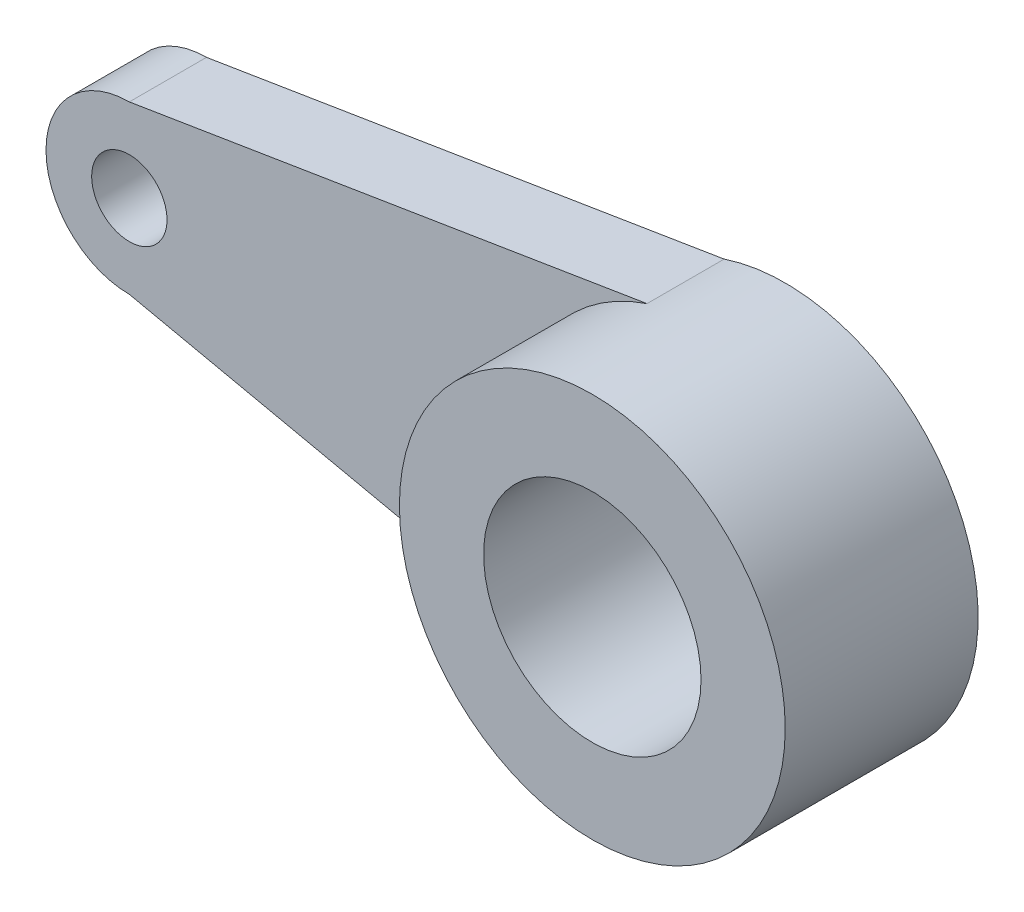
ISO-10303-21;
HEADER;
FILE_DESCRIPTION(('STEP AP214'),'2;1');
FILE_NAME('part.step','',(''),(''),'','','');
FILE_SCHEMA(('AUTOMOTIVE_DESIGN { 1 0 10303 214 1 1 1 1 }'));
ENDSEC;
DATA;
#1=APPLICATION_CONTEXT('core data for automotive mechanical design processes');
#2=APPLICATION_PROTOCOL_DEFINITION('international standard','automotive_design',2000,#1);
#3=PRODUCT_CONTEXT('',#1,'mechanical');
#4=PRODUCT('Part','Part','',(#3));
#5=PRODUCT_RELATED_PRODUCT_CATEGORY('part','',(#4));
#6=PRODUCT_DEFINITION_FORMATION('','',#4);
#7=PRODUCT_DEFINITION_CONTEXT('part definition',#1,'design');
#8=PRODUCT_DEFINITION('design','',#6,#7);
#9=PRODUCT_DEFINITION_SHAPE('','',#8);
#10=(LENGTH_UNIT() NAMED_UNIT(*) SI_UNIT(.MILLI.,.METRE.));
#11=(NAMED_UNIT(*) PLANE_ANGLE_UNIT() SI_UNIT($,.RADIAN.));
#12=(NAMED_UNIT(*) SI_UNIT($,.STERADIAN.) SOLID_ANGLE_UNIT());
#13=UNCERTAINTY_MEASURE_WITH_UNIT(LENGTH_MEASURE(1.E-05),#10,'distance_accuracy_value','');
#14=(GEOMETRIC_REPRESENTATION_CONTEXT(3) GLOBAL_UNCERTAINTY_ASSIGNED_CONTEXT((#13)) GLOBAL_UNIT_ASSIGNED_CONTEXT((#10,
#11,#12)) REPRESENTATION_CONTEXT('',''));
#15=CARTESIAN_POINT('',(0.,0.,0.));
#16=DIRECTION('',(0.,0.,1.));
#17=DIRECTION('',(1.,0.,0.));
#18=AXIS2_PLACEMENT_3D('',#15,#16,#17);
#19=CARTESIAN_POINT('',(20.9795633613523,15.1546389726253,5.));
#20=DIRECTION('',(0.,0.,1.));
#21=DIRECTION('',(1.,0.,0.));
#22=AXIS2_PLACEMENT_3D('',#19,#20,#21);
#23=PLANE('',#22);
#24=CARTESIAN_POINT('',(20.9795633613523,15.1546389726253,5.));
#25=DIRECTION('',(0.,0.,1.));
#26=DIRECTION('',(1.,0.,0.));
#27=AXIS2_PLACEMENT_3D('',#24,#25,#26);
#28=CIRCLE('',#27,5.);
#29=CARTESIAN_POINT('',(25.9795633613523,15.1546389726253,5.));
#30=VERTEX_POINT('',#29);
#31=EDGE_CURVE('E112',#30,#30,#28,.T.);
#32=ORIENTED_EDGE('',*,*,#31,.T.);
#33=EDGE_LOOP('',(#32));
#34=FACE_BOUND('',#33,.T.);
#35=CARTESIAN_POINT('',(20.9795633613523,15.1546389726253,5.));
#36=DIRECTION('',(0.,0.,1.));
#37=DIRECTION('',(1.,0.,0.));
#38=AXIS2_PLACEMENT_3D('',#35,#36,#37);
#39=CIRCLE('',#38,2.8179093361604);
#40=CARTESIAN_POINT('',(23.7974726975127,15.1546389726253,5.));
#41=VERTEX_POINT('',#40);
#42=EDGE_CURVE('E106',#41,#41,#39,.T.);
#43=ORIENTED_EDGE('',*,*,#42,.F.);
#44=EDGE_LOOP('',(#43));
#45=FACE_BOUND('',#44,.T.);
#46=ADVANCED_FACE('F33',(#34,#45),#23,.T.);
#47=CARTESIAN_POINT('',(20.9795633613523,15.1546389726253,0.));
#48=DIRECTION('',(0.,0.,1.));
#49=DIRECTION('',(1.,0.,0.));
#50=AXIS2_PLACEMENT_3D('',#47,#48,#49);
#51=PLANE('',#50);
#52=CARTESIAN_POINT('',(20.9795633613523,15.1546389726253,0.));
#53=DIRECTION('',(0.,0.,1.));
#54=DIRECTION('',(1.,0.,0.));
#55=AXIS2_PLACEMENT_3D('',#52,#53,#54);
#56=CIRCLE('',#55,5.);
#57=CARTESIAN_POINT('',(18.9143539599568,10.6010788128835,0.));
#58=VERTEX_POINT('',#57);
#59=CARTESIAN_POINT('',(19.3963911171883,19.897377173845,0.));
#60=VERTEX_POINT('',#59);
#61=EDGE_CURVE('E109',#58,#60,#56,.T.);
#62=ORIENTED_EDGE('',*,*,#61,.F.);
#63=DIRECTION('',(-0.977423150930129,0.211291230357102,0.));
#64=VECTOR('',#63,1.);
#65=CARTESIAN_POINT('',(20.9795633613523,10.1546389726253,0.));
#66=LINE('',#65,#64);
#67=CARTESIAN_POINT('',(5.97956336135227,13.3972145677915,0.));
#68=VERTEX_POINT('',#67);
#69=EDGE_CURVE('E98',#58,#68,#66,.T.);
#70=ORIENTED_EDGE('',*,*,#69,.T.);
#71=CARTESIAN_POINT('',(5.97956336135227,15.5571942551806,0.));
#72=DIRECTION('',(0.,0.,-1.));
#73=DIRECTION('',(1.,0.,0.));
#74=AXIS2_PLACEMENT_3D('',#71,#72,#73);
#75=CIRCLE('',#74,2.15997968738906);
#76=CARTESIAN_POINT('',(5.97956336135227,17.7171739425696,0.));
#77=VERTEX_POINT('',#76);
#78=EDGE_CURVE('E87',#68,#77,#75,.T.);
#79=ORIENTED_EDGE('',*,*,#78,.T.);
#80=DIRECTION('',(0.987053098937423,0.160393827431201,0.));
#81=VECTOR('',#80,1.);
#82=CARTESIAN_POINT('',(20.9795633613523,20.1546389726253,0.));
#83=LINE('',#82,#81);
#84=EDGE_CURVE('E80',#77,#60,#83,.T.);
#85=ORIENTED_EDGE('',*,*,#84,.T.);
#86=EDGE_LOOP('',(#62,#70,#79,#85));
#87=FACE_BOUND('',#86,.T.);
#88=CARTESIAN_POINT('',(20.9795633613523,15.1546389726253,0.));
#89=DIRECTION('',(0.,0.,1.));
#90=DIRECTION('',(1.,0.,0.));
#91=AXIS2_PLACEMENT_3D('',#88,#89,#90);
#92=CIRCLE('',#91,2.8179093361604);
#93=CARTESIAN_POINT('',(23.7974726975127,15.1546389726253,0.));
#94=VERTEX_POINT('',#93);
#95=EDGE_CURVE('E104',#94,#94,#92,.T.);
#96=ORIENTED_EDGE('',*,*,#95,.T.);
#97=EDGE_LOOP('',(#96));
#98=FACE_BOUND('',#97,.T.);
#99=CARTESIAN_POINT('',(5.97956336135227,15.5571942551806,0.));
#100=DIRECTION('',(0.,0.,-1.));
#101=DIRECTION('',(-1.,0.,0.));
#102=AXIS2_PLACEMENT_3D('',#99,#100,#101);
#103=CIRCLE('',#102,0.976753742064855);
#104=CARTESIAN_POINT('',(5.00280961928741,15.5571942551806,0.));
#105=VERTEX_POINT('',#104);
#106=EDGE_CURVE('E159',#105,#105,#103,.T.);
#107=ORIENTED_EDGE('',*,*,#106,.F.);
#108=EDGE_LOOP('',(#107));
#109=FACE_BOUND('',#108,.T.);
#110=ADVANCED_FACE('F118',(#87,#98,#109),#51,.F.);
#111=CARTESIAN_POINT('',(20.9795633613523,15.1546389726253,5.));
#112=DIRECTION('',(0.,0.,-1.));
#113=DIRECTION('',(-1.,0.,0.));
#114=AXIS2_PLACEMENT_3D('',#111,#112,#113);
#115=CYLINDRICAL_SURFACE('',#114,5.);
#116=DIRECTION('',(0.,0.,-1.));
#117=VECTOR('',#116,1.);
#118=CARTESIAN_POINT('',(18.9143539599568,10.6010788128835,5.));
#119=LINE('',#118,#117);
#120=CARTESIAN_POINT('',(18.9143539599568,10.6010788128835,2.));
#121=VERTEX_POINT('',#120);
#122=EDGE_CURVE('E41',#121,#58,#119,.T.);
#123=ORIENTED_EDGE('',*,*,#122,.T.);
#124=ORIENTED_EDGE('',*,*,#61,.T.);
#125=DIRECTION('',(0.,0.,-1.));
#126=VECTOR('',#125,1.);
#127=CARTESIAN_POINT('',(19.3963911171882,19.897377173845,5.));
#128=LINE('',#127,#126);
#129=CARTESIAN_POINT('',(19.3963911171883,19.897377173845,2.));
#130=VERTEX_POINT('',#129);
#131=EDGE_CURVE('E11',#60,#130,#128,.F.);
#132=ORIENTED_EDGE('',*,*,#131,.T.);
#133=CARTESIAN_POINT('',(20.9795633613523,15.1546389726253,2.));
#134=DIRECTION('',(0.,0.,1.));
#135=DIRECTION('',(1.,0.,0.));
#136=AXIS2_PLACEMENT_3D('',#133,#134,#135);
#137=CIRCLE('',#136,5.);
#138=EDGE_CURVE('E47',#130,#121,#137,.T.);
#139=ORIENTED_EDGE('',*,*,#138,.T.);
#140=EDGE_LOOP('',(#123,#124,#132,#139));
#141=FACE_BOUND('',#140,.T.);
#142=ORIENTED_EDGE('',*,*,#31,.F.);
#143=EDGE_LOOP('',(#142));
#144=FACE_BOUND('',#143,.T.);
#145=ADVANCED_FACE('F35',(#141,#144),#115,.T.);
#146=CARTESIAN_POINT('',(20.9795633613523,15.1546389726253,5.));
#147=DIRECTION('',(0.,0.,-1.));
#148=DIRECTION('',(-1.,0.,0.));
#149=AXIS2_PLACEMENT_3D('',#146,#147,#148);
#150=CYLINDRICAL_SURFACE('',#149,2.8179093361604);
#151=ORIENTED_EDGE('',*,*,#42,.T.);
#152=EDGE_LOOP('',(#151));
#153=FACE_BOUND('',#152,.T.);
#154=ORIENTED_EDGE('',*,*,#95,.F.);
#155=EDGE_LOOP('',(#154));
#156=FACE_BOUND('',#155,.T.);
#157=ADVANCED_FACE('F124',(#153,#156),#150,.F.);
#158=CARTESIAN_POINT('',(20.9795633613523,20.1546389726253,2.));
#159=DIRECTION('',(-0.160393827431201,0.987053098937423,0.));
#160=DIRECTION('',(-0.987053098937423,-0.160393827431201,0.));
#161=AXIS2_PLACEMENT_3D('',#158,#159,#160);
#162=PLANE('',#161);
#163=ORIENTED_EDGE('',*,*,#131,.F.);
#164=ORIENTED_EDGE('',*,*,#84,.F.);
#165=DIRECTION('',(0.,0.,-1.));
#166=VECTOR('',#165,1.);
#167=CARTESIAN_POINT('',(5.97956336135227,17.7171739425696,2.));
#168=LINE('',#167,#166);
#169=CARTESIAN_POINT('',(5.97956336135227,17.7171739425696,2.));
#170=VERTEX_POINT('',#169);
#171=EDGE_CURVE('E88',#170,#77,#168,.T.);
#172=ORIENTED_EDGE('',*,*,#171,.F.);
#173=DIRECTION('',(0.987053098937423,0.160393827431201,0.));
#174=VECTOR('',#173,1.);
#175=CARTESIAN_POINT('',(20.9795633613523,20.1546389726253,2.));
#176=LINE('',#175,#174);
#177=EDGE_CURVE('E89',#170,#130,#176,.T.);
#178=ORIENTED_EDGE('',*,*,#177,.T.);
#179=EDGE_LOOP('',(#163,#164,#172,#178));
#180=FACE_BOUND('',#179,.T.);
#181=ADVANCED_FACE('F122',(#180),#162,.T.);
#182=CARTESIAN_POINT('',(20.9795633613523,10.1546389726253,2.));
#183=DIRECTION('',(-0.211291230357102,-0.977423150930129,0.));
#184=DIRECTION('',(0.977423150930129,-0.211291230357102,0.));
#185=AXIS2_PLACEMENT_3D('',#182,#183,#184);
#186=PLANE('',#185);
#187=ORIENTED_EDGE('',*,*,#122,.F.);
#188=DIRECTION('',(-0.977423150930129,0.211291230357102,0.));
#189=VECTOR('',#188,1.);
#190=CARTESIAN_POINT('',(20.9795633613523,10.1546389726253,2.));
#191=LINE('',#190,#189);
#192=CARTESIAN_POINT('',(5.97956336135227,13.3972145677915,2.));
#193=VERTEX_POINT('',#192);
#194=EDGE_CURVE('E71',#121,#193,#191,.T.);
#195=ORIENTED_EDGE('',*,*,#194,.T.);
#196=DIRECTION('',(0.,0.,-1.));
#197=VECTOR('',#196,1.);
#198=CARTESIAN_POINT('',(5.97956336135227,13.3972145677915,2.));
#199=LINE('',#198,#197);
#200=EDGE_CURVE('E75',#193,#68,#199,.T.);
#201=ORIENTED_EDGE('',*,*,#200,.T.);
#202=ORIENTED_EDGE('',*,*,#69,.F.);
#203=EDGE_LOOP('',(#187,#195,#201,#202));
#204=FACE_BOUND('',#203,.T.);
#205=ADVANCED_FACE('F73',(#204),#186,.T.);
#206=CARTESIAN_POINT('',(5.97956336135227,15.5571942551806,2.));
#207=DIRECTION('',(0.,0.,-1.));
#208=DIRECTION('',(-1.,0.,0.));
#209=AXIS2_PLACEMENT_3D('',#206,#207,#208);
#210=CYLINDRICAL_SURFACE('',#209,2.15997968738906);
#211=ORIENTED_EDGE('',*,*,#78,.F.);
#212=ORIENTED_EDGE('',*,*,#200,.F.);
#213=CARTESIAN_POINT('',(5.97956336135227,15.5571942551806,2.));
#214=DIRECTION('',(0.,0.,-1.));
#215=DIRECTION('',(1.,0.,0.));
#216=AXIS2_PLACEMENT_3D('',#213,#214,#215);
#217=CIRCLE('',#216,2.15997968738906);
#218=EDGE_CURVE('E79',#193,#170,#217,.T.);
#219=ORIENTED_EDGE('',*,*,#218,.T.);
#220=ORIENTED_EDGE('',*,*,#171,.T.);
#221=EDGE_LOOP('',(#211,#212,#219,#220));
#222=FACE_BOUND('',#221,.T.);
#223=ADVANCED_FACE('F84',(#222),#210,.T.);
#224=CARTESIAN_POINT('',(5.97956336135227,15.5571942551806,2.));
#225=DIRECTION('',(0.,0.,1.));
#226=DIRECTION('',(1.,0.,0.));
#227=AXIS2_PLACEMENT_3D('',#224,#225,#226);
#228=PLANE('',#227);
#229=ORIENTED_EDGE('',*,*,#138,.F.);
#230=ORIENTED_EDGE('',*,*,#177,.F.);
#231=ORIENTED_EDGE('',*,*,#218,.F.);
#232=ORIENTED_EDGE('',*,*,#194,.F.);
#233=EDGE_LOOP('',(#229,#230,#231,#232));
#234=FACE_BOUND('',#233,.T.);
#235=CARTESIAN_POINT('',(5.97956336135227,15.5571942551806,2.));
#236=DIRECTION('',(0.,0.,-1.));
#237=DIRECTION('',(-1.,0.,0.));
#238=AXIS2_PLACEMENT_3D('',#235,#236,#237);
#239=CIRCLE('',#238,0.976753742064855);
#240=CARTESIAN_POINT('',(5.00280961928741,15.5571942551806,2.));
#241=VERTEX_POINT('',#240);
#242=EDGE_CURVE('E100',#241,#241,#239,.T.);
#243=ORIENTED_EDGE('',*,*,#242,.T.);
#244=EDGE_LOOP('',(#243));
#245=FACE_BOUND('',#244,.T.);
#246=ADVANCED_FACE('F91',(#234,#245),#228,.T.);
#247=CARTESIAN_POINT('',(5.97956336135227,15.5571942551806,2.));
#248=DIRECTION('',(0.,0.,-1.));
#249=DIRECTION('',(-1.,0.,0.));
#250=AXIS2_PLACEMENT_3D('',#247,#248,#249);
#251=CYLINDRICAL_SURFACE('',#250,0.976753742064855);
#252=ORIENTED_EDGE('',*,*,#242,.F.);
#253=EDGE_LOOP('',(#252));
#254=FACE_BOUND('',#253,.T.);
#255=ORIENTED_EDGE('',*,*,#106,.T.);
#256=EDGE_LOOP('',(#255));
#257=FACE_BOUND('',#256,.T.);
#258=ADVANCED_FACE('F146',(#254,#257),#251,.F.);
#259=CLOSED_SHELL('',(#46,#110,#145,#157,#181,#205,#223,#246,#258));
#260=MANIFOLD_SOLID_BREP('B2',#259);
#261=ADVANCED_BREP_SHAPE_REPRESENTATION('',(#18,#260),#14);
#262=SHAPE_DEFINITION_REPRESENTATION(#9,#261);
ENDSEC;
END-ISO-10303-21;
